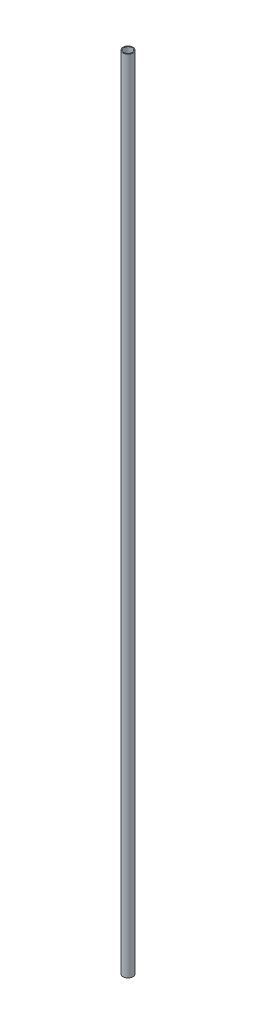
ISO-10303-21;
HEADER;
FILE_DESCRIPTION(('STEP AP214'),'2;1');
FILE_NAME('part.step','',(''),(''),'','','');
FILE_SCHEMA(('AUTOMOTIVE_DESIGN { 1 0 10303 214 1 1 1 1 }'));
ENDSEC;
DATA;
#1=APPLICATION_CONTEXT('core data for automotive mechanical design processes');
#2=APPLICATION_PROTOCOL_DEFINITION('international standard','automotive_design',2000,#1);
#3=PRODUCT_CONTEXT('',#1,'mechanical');
#4=PRODUCT('Part','Part','',(#3));
#5=PRODUCT_RELATED_PRODUCT_CATEGORY('part','',(#4));
#6=PRODUCT_DEFINITION_FORMATION('','',#4);
#7=PRODUCT_DEFINITION_CONTEXT('part definition',#1,'design');
#8=PRODUCT_DEFINITION('design','',#6,#7);
#9=PRODUCT_DEFINITION_SHAPE('','',#8);
#10=(LENGTH_UNIT() NAMED_UNIT(*) SI_UNIT(.MILLI.,.METRE.));
#11=(NAMED_UNIT(*) PLANE_ANGLE_UNIT() SI_UNIT($,.RADIAN.));
#12=(NAMED_UNIT(*) SI_UNIT($,.STERADIAN.) SOLID_ANGLE_UNIT());
#13=UNCERTAINTY_MEASURE_WITH_UNIT(LENGTH_MEASURE(1.E-05),#10,'distance_accuracy_value','');
#14=(GEOMETRIC_REPRESENTATION_CONTEXT(3) GLOBAL_UNCERTAINTY_ASSIGNED_CONTEXT((#13)) GLOBAL_UNIT_ASSIGNED_CONTEXT((#10,
#11,#12)) REPRESENTATION_CONTEXT('',''));
#15=CARTESIAN_POINT('',(0.,0.,0.));
#16=DIRECTION('',(0.,0.,1.));
#17=DIRECTION('',(1.,0.,0.));
#18=AXIS2_PLACEMENT_3D('',#15,#16,#17);
#19=CARTESIAN_POINT('',(0.,480.,0.));
#20=DIRECTION('',(0.,1.,0.));
#21=DIRECTION('',(0.,0.,1.));
#22=AXIS2_PLACEMENT_3D('',#19,#20,#21);
#23=PLANE('',#22);
#24=CARTESIAN_POINT('',(0.,480.,0.));
#25=DIRECTION('',(0.,1.,0.));
#26=DIRECTION('',(0.,0.,1.));
#27=AXIS2_PLACEMENT_3D('',#24,#25,#26);
#28=CIRCLE('',#27,3.);
#29=CARTESIAN_POINT('',(0.,480.,3.));
#30=VERTEX_POINT('',#29);
#31=EDGE_CURVE('E10',#30,#30,#28,.T.);
#32=ORIENTED_EDGE('',*,*,#31,.T.);
#33=EDGE_LOOP('',(#32));
#34=FACE_BOUND('',#33,.T.);
#35=CARTESIAN_POINT('',(0.,480.,0.));
#36=DIRECTION('',(0.,1.,0.));
#37=DIRECTION('',(0.,0.,1.));
#38=AXIS2_PLACEMENT_3D('',#35,#36,#37);
#39=CIRCLE('',#38,2.5);
#40=CARTESIAN_POINT('',(0.,480.,2.5));
#41=VERTEX_POINT('',#40);
#42=EDGE_CURVE('E56',#41,#41,#39,.T.);
#43=ORIENTED_EDGE('',*,*,#42,.F.);
#44=EDGE_LOOP('',(#43));
#45=FACE_BOUND('',#44,.T.);
#46=ADVANCED_FACE('F43',(#34,#45),#23,.T.);
#47=CARTESIAN_POINT('',(0.,0.,0.));
#48=DIRECTION('',(0.,1.,0.));
#49=DIRECTION('',(0.,0.,1.));
#50=AXIS2_PLACEMENT_3D('',#47,#48,#49);
#51=PLANE('',#50);
#52=CARTESIAN_POINT('',(0.,0.,0.));
#53=DIRECTION('',(0.,1.,0.));
#54=DIRECTION('',(0.,0.,1.));
#55=AXIS2_PLACEMENT_3D('',#52,#53,#54);
#56=CIRCLE('',#55,3.);
#57=CARTESIAN_POINT('',(0.,0.,3.));
#58=VERTEX_POINT('',#57);
#59=EDGE_CURVE('E47',#58,#58,#56,.T.);
#60=ORIENTED_EDGE('',*,*,#59,.F.);
#61=EDGE_LOOP('',(#60));
#62=FACE_BOUND('',#61,.T.);
#63=CARTESIAN_POINT('',(0.,0.,0.));
#64=DIRECTION('',(0.,1.,0.));
#65=DIRECTION('',(0.,0.,1.));
#66=AXIS2_PLACEMENT_3D('',#63,#64,#65);
#67=CIRCLE('',#66,2.5);
#68=CARTESIAN_POINT('',(0.,0.,2.5));
#69=VERTEX_POINT('',#68);
#70=EDGE_CURVE('E58',#69,#69,#67,.T.);
#71=ORIENTED_EDGE('',*,*,#70,.T.);
#72=EDGE_LOOP('',(#71));
#73=FACE_BOUND('',#72,.T.);
#74=ADVANCED_FACE('F70',(#62,#73),#51,.F.);
#75=CARTESIAN_POINT('',(0.,480.,0.));
#76=DIRECTION('',(0.,-1.,0.));
#77=DIRECTION('',(0.,0.,-1.));
#78=AXIS2_PLACEMENT_3D('',#75,#76,#77);
#79=CYLINDRICAL_SURFACE('',#78,3.);
#80=ORIENTED_EDGE('',*,*,#31,.F.);
#81=EDGE_LOOP('',(#80));
#82=FACE_BOUND('',#81,.T.);
#83=ORIENTED_EDGE('',*,*,#59,.T.);
#84=EDGE_LOOP('',(#83));
#85=FACE_BOUND('',#84,.T.);
#86=ADVANCED_FACE('F45',(#82,#85),#79,.T.);
#87=CARTESIAN_POINT('',(0.,480.,0.));
#88=DIRECTION('',(0.,-1.,0.));
#89=DIRECTION('',(0.,0.,-1.));
#90=AXIS2_PLACEMENT_3D('',#87,#88,#89);
#91=CYLINDRICAL_SURFACE('',#90,2.5);
#92=ORIENTED_EDGE('',*,*,#42,.T.);
#93=EDGE_LOOP('',(#92));
#94=FACE_BOUND('',#93,.T.);
#95=ORIENTED_EDGE('',*,*,#70,.F.);
#96=EDGE_LOOP('',(#95));
#97=FACE_BOUND('',#96,.T.);
#98=ADVANCED_FACE('F66',(#94,#97),#91,.F.);
#99=CLOSED_SHELL('',(#46,#74,#86,#98));
#100=MANIFOLD_SOLID_BREP('B2',#99);
#101=ADVANCED_BREP_SHAPE_REPRESENTATION('',(#18,#100),#14);
#102=SHAPE_DEFINITION_REPRESENTATION(#9,#101);
ENDSEC;
END-ISO-10303-21;
